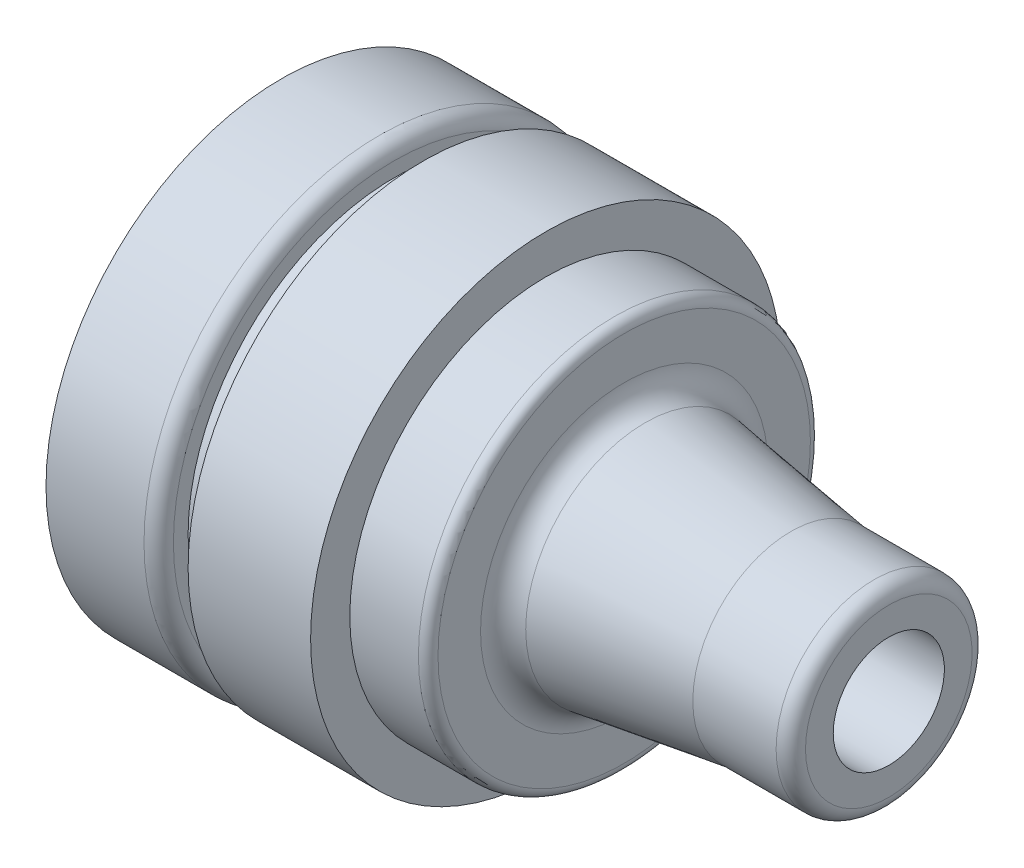
ISO-10303-21;
HEADER;
FILE_DESCRIPTION(('STEP AP214'),'2;1');
FILE_NAME('part.step','',(''),(''),'','','');
FILE_SCHEMA(('AUTOMOTIVE_DESIGN { 1 0 10303 214 1 1 1 1 }'));
ENDSEC;
DATA;
#1=APPLICATION_CONTEXT('core data for automotive mechanical design processes');
#2=APPLICATION_PROTOCOL_DEFINITION('international standard','automotive_design',2000,#1);
#3=PRODUCT_CONTEXT('',#1,'mechanical');
#4=PRODUCT('Part','Part','',(#3));
#5=PRODUCT_RELATED_PRODUCT_CATEGORY('part','',(#4));
#6=PRODUCT_DEFINITION_FORMATION('','',#4);
#7=PRODUCT_DEFINITION_CONTEXT('part definition',#1,'design');
#8=PRODUCT_DEFINITION('design','',#6,#7);
#9=PRODUCT_DEFINITION_SHAPE('','',#8);
#10=(LENGTH_UNIT() NAMED_UNIT(*) SI_UNIT(.MILLI.,.METRE.));
#11=(NAMED_UNIT(*) PLANE_ANGLE_UNIT() SI_UNIT($,.RADIAN.));
#12=(NAMED_UNIT(*) SI_UNIT($,.STERADIAN.) SOLID_ANGLE_UNIT());
#13=UNCERTAINTY_MEASURE_WITH_UNIT(LENGTH_MEASURE(1.E-05),#10,'distance_accuracy_value','');
#14=(GEOMETRIC_REPRESENTATION_CONTEXT(3) GLOBAL_UNCERTAINTY_ASSIGNED_CONTEXT((#13)) GLOBAL_UNIT_ASSIGNED_CONTEXT((#10,
#11,#12)) REPRESENTATION_CONTEXT('',''));
#15=CARTESIAN_POINT('',(0.,0.,0.));
#16=DIRECTION('',(0.,0.,1.));
#17=DIRECTION('',(1.,0.,0.));
#18=AXIS2_PLACEMENT_3D('',#15,#16,#17);
#19=CARTESIAN_POINT('',(14.040782396088,0.,0.));
#20=DIRECTION('',(-1.,0.,0.));
#21=DIRECTION('',(0.,0.,1.));
#22=AXIS2_PLACEMENT_3D('',#19,#20,#21);
#23=PLANE('',#22);
#24=CARTESIAN_POINT('',(14.040782396088,0.,0.));
#25=DIRECTION('',(-1.,0.,0.));
#26=DIRECTION('',(0.,0.,1.));
#27=AXIS2_PLACEMENT_3D('',#24,#25,#26);
#28=CIRCLE('',#27,45.);
#29=CARTESIAN_POINT('',(14.040782396088,0.,45.));
#30=VERTEX_POINT('',#29);
#31=EDGE_CURVE('E10',#30,#30,#28,.T.);
#32=ORIENTED_EDGE('',*,*,#31,.F.);
#33=EDGE_LOOP('',(#32));
#34=FACE_BOUND('',#33,.T.);
#35=CARTESIAN_POINT('',(14.040782396088,0.,0.));
#36=DIRECTION('',(-1.,0.,0.));
#37=DIRECTION('',(0.,0.,1.));
#38=AXIS2_PLACEMENT_3D('',#35,#36,#37);
#39=CIRCLE('',#38,42.);
#40=CARTESIAN_POINT('',(14.040782396088,0.,42.));
#41=VERTEX_POINT('',#40);
#42=EDGE_CURVE('E97',#41,#41,#39,.T.);
#43=ORIENTED_EDGE('',*,*,#42,.T.);
#44=EDGE_LOOP('',(#43));
#45=FACE_BOUND('',#44,.T.);
#46=ADVANCED_FACE('F33',(#34,#45),#23,.F.);
#47=CARTESIAN_POINT('',(11.040782396088,0.,0.));
#48=DIRECTION('',(-1.,0.,0.));
#49=DIRECTION('',(0.,0.,1.));
#50=AXIS2_PLACEMENT_3D('',#47,#48,#49);
#51=TOROIDAL_SURFACE('',#50,45.,3.);
#52=CARTESIAN_POINT('',(11.040782396088,0.,0.));
#53=DIRECTION('',(-1.,0.,0.));
#54=DIRECTION('',(0.,0.,1.));
#55=AXIS2_PLACEMENT_3D('',#52,#53,#54);
#56=CIRCLE('',#55,48.);
#57=CARTESIAN_POINT('',(11.040782396088,0.,48.));
#58=VERTEX_POINT('',#57);
#59=EDGE_CURVE('E39',#58,#58,#56,.T.);
#60=ORIENTED_EDGE('',*,*,#59,.F.);
#61=EDGE_LOOP('',(#60));
#62=FACE_BOUND('',#61,.T.);
#63=ORIENTED_EDGE('',*,*,#31,.T.);
#64=EDGE_LOOP('',(#63));
#65=FACE_BOUND('',#64,.T.);
#66=ADVANCED_FACE('F132',(#62,#65),#51,.T.);
#67=CARTESIAN_POINT('',(0.,0.,0.));
#68=DIRECTION('',(-1.,0.,0.));
#69=DIRECTION('',(0.,0.,1.));
#70=AXIS2_PLACEMENT_3D('',#67,#68,#69);
#71=CYLINDRICAL_SURFACE('',#70,48.);
#72=CARTESIAN_POINT('',(-8.95921760391199,0.,0.));
#73=DIRECTION('',(-1.,0.,0.));
#74=DIRECTION('',(0.,0.,1.));
#75=AXIS2_PLACEMENT_3D('',#72,#73,#74);
#76=CIRCLE('',#75,48.);
#77=CARTESIAN_POINT('',(-8.95921760391199,0.,48.));
#78=VERTEX_POINT('',#77);
#79=EDGE_CURVE('E43',#78,#78,#76,.T.);
#80=ORIENTED_EDGE('',*,*,#79,.F.);
#81=EDGE_LOOP('',(#80));
#82=FACE_BOUND('',#81,.T.);
#83=ORIENTED_EDGE('',*,*,#59,.T.);
#84=EDGE_LOOP('',(#83));
#85=FACE_BOUND('',#84,.T.);
#86=ADVANCED_FACE('F137',(#82,#85),#71,.T.);
#87=CARTESIAN_POINT('',(-8.95921760391199,0.,0.));
#88=DIRECTION('',(1.,0.,0.));
#89=DIRECTION('',(0.,0.,-1.));
#90=AXIS2_PLACEMENT_3D('',#87,#88,#89);
#91=PLANE('',#90);
#92=CARTESIAN_POINT('',(-8.95921760391199,0.,0.));
#93=DIRECTION('',(-1.,0.,0.));
#94=DIRECTION('',(0.,0.,1.));
#95=AXIS2_PLACEMENT_3D('',#92,#93,#94);
#96=CIRCLE('',#95,38.);
#97=CARTESIAN_POINT('',(-8.95921760391199,0.,38.));
#98=VERTEX_POINT('',#97);
#99=EDGE_CURVE('E47',#98,#98,#96,.T.);
#100=ORIENTED_EDGE('',*,*,#99,.F.);
#101=EDGE_LOOP('',(#100));
#102=FACE_BOUND('',#101,.T.);
#103=ORIENTED_EDGE('',*,*,#79,.T.);
#104=EDGE_LOOP('',(#103));
#105=FACE_BOUND('',#104,.T.);
#106=ADVANCED_FACE('F142',(#102,#105),#91,.F.);
#107=CARTESIAN_POINT('',(-8.95921760391199,0.,0.));
#108=DIRECTION('',(-1.,0.,0.));
#109=DIRECTION('',(0.,0.,1.));
#110=AXIS2_PLACEMENT_3D('',#107,#108,#109);
#111=CONICAL_SURFACE('',#110,38.,1.12844452455231);
#112=CARTESIAN_POINT('',(0.,0.,0.));
#113=DIRECTION('',(-1.,0.,0.));
#114=DIRECTION('',(0.,0.,1.));
#115=AXIS2_PLACEMENT_3D('',#112,#113,#114);
#116=CIRCLE('',#115,19.085);
#117=CARTESIAN_POINT('',(0.,0.,19.085));
#118=VERTEX_POINT('',#117);
#119=EDGE_CURVE('E52',#118,#118,#116,.T.);
#120=ORIENTED_EDGE('',*,*,#119,.F.);
#121=EDGE_LOOP('',(#120));
#122=FACE_BOUND('',#121,.T.);
#123=ORIENTED_EDGE('',*,*,#99,.T.);
#124=EDGE_LOOP('',(#123));
#125=FACE_BOUND('',#124,.T.);
#126=ADVANCED_FACE('F148',(#122,#125),#111,.F.);
#127=CARTESIAN_POINT('',(0.,0.,0.));
#128=DIRECTION('',(-1.,0.,0.));
#129=DIRECTION('',(0.,0.,1.));
#130=AXIS2_PLACEMENT_3D('',#127,#128,#129);
#131=CYLINDRICAL_SURFACE('',#130,19.085);
#132=CARTESIAN_POINT('',(57.520391198044,0.,0.));
#133=DIRECTION('',(-1.,0.,0.));
#134=DIRECTION('',(0.,0.,1.));
#135=AXIS2_PLACEMENT_3D('',#132,#133,#134);
#136=CIRCLE('',#135,19.085);
#137=CARTESIAN_POINT('',(57.520391198044,0.,19.085));
#138=VERTEX_POINT('',#137);
#139=EDGE_CURVE('E55',#138,#138,#136,.T.);
#140=ORIENTED_EDGE('',*,*,#139,.F.);
#141=EDGE_LOOP('',(#140));
#142=FACE_BOUND('',#141,.T.);
#143=ORIENTED_EDGE('',*,*,#119,.T.);
#144=EDGE_LOOP('',(#143));
#145=FACE_BOUND('',#144,.T.);
#146=ADVANCED_FACE('F152',(#142,#145),#131,.F.);
#147=CARTESIAN_POINT('',(57.520391198044,0.,0.));
#148=DIRECTION('',(1.,0.,0.));
#149=DIRECTION('',(0.,0.,-1.));
#150=AXIS2_PLACEMENT_3D('',#147,#148,#149);
#151=PLANE('',#150);
#152=CARTESIAN_POINT('',(57.520391198044,0.,0.));
#153=DIRECTION('',(-1.,0.,0.));
#154=DIRECTION('',(0.,0.,1.));
#155=AXIS2_PLACEMENT_3D('',#152,#153,#154);
#156=CIRCLE('',#155,11.3390097799511);
#157=CARTESIAN_POINT('',(57.520391198044,0.,11.3390097799511));
#158=VERTEX_POINT('',#157);
#159=EDGE_CURVE('E58',#158,#158,#156,.T.);
#160=ORIENTED_EDGE('',*,*,#159,.F.);
#161=EDGE_LOOP('',(#160));
#162=FACE_BOUND('',#161,.T.);
#163=ORIENTED_EDGE('',*,*,#139,.T.);
#164=EDGE_LOOP('',(#163));
#165=FACE_BOUND('',#164,.T.);
#166=ADVANCED_FACE('F156',(#162,#165),#151,.F.);
#167=CARTESIAN_POINT('',(0.,0.,0.));
#168=DIRECTION('',(-1.,0.,0.));
#169=DIRECTION('',(0.,0.,1.));
#170=AXIS2_PLACEMENT_3D('',#167,#168,#169);
#171=CYLINDRICAL_SURFACE('',#170,11.3390097799511);
#172=CARTESIAN_POINT('',(115.040782396088,0.,0.));
#173=DIRECTION('',(-1.,0.,0.));
#174=DIRECTION('',(0.,0.,1.));
#175=AXIS2_PLACEMENT_3D('',#172,#173,#174);
#176=CIRCLE('',#175,11.3390097799511);
#177=CARTESIAN_POINT('',(115.040782396088,0.,11.3390097799511));
#178=VERTEX_POINT('',#177);
#179=EDGE_CURVE('E61',#178,#178,#176,.T.);
#180=ORIENTED_EDGE('',*,*,#179,.F.);
#181=EDGE_LOOP('',(#180));
#182=FACE_BOUND('',#181,.T.);
#183=ORIENTED_EDGE('',*,*,#159,.T.);
#184=EDGE_LOOP('',(#183));
#185=FACE_BOUND('',#184,.T.);
#186=ADVANCED_FACE('F160',(#182,#185),#171,.F.);
#187=CARTESIAN_POINT('',(115.040782396088,0.,0.));
#188=DIRECTION('',(-1.,0.,0.));
#189=DIRECTION('',(0.,0.,1.));
#190=AXIS2_PLACEMENT_3D('',#187,#188,#189);
#191=PLANE('',#190);
#192=CARTESIAN_POINT('',(115.040782396088,0.,0.));
#193=DIRECTION('',(-1.,0.,0.));
#194=DIRECTION('',(0.,0.,1.));
#195=AXIS2_PLACEMENT_3D('',#192,#193,#194);
#196=CIRCLE('',#195,17.);
#197=CARTESIAN_POINT('',(115.040782396088,0.,17.));
#198=VERTEX_POINT('',#197);
#199=EDGE_CURVE('E64',#198,#198,#196,.T.);
#200=ORIENTED_EDGE('',*,*,#199,.F.);
#201=EDGE_LOOP('',(#200));
#202=FACE_BOUND('',#201,.T.);
#203=ORIENTED_EDGE('',*,*,#179,.T.);
#204=EDGE_LOOP('',(#203));
#205=FACE_BOUND('',#204,.T.);
#206=ADVANCED_FACE('F164',(#202,#205),#191,.F.);
#207=CARTESIAN_POINT('',(112.040782396088,0.,0.));
#208=DIRECTION('',(-1.,0.,0.));
#209=DIRECTION('',(0.,0.,1.));
#210=AXIS2_PLACEMENT_3D('',#207,#208,#209);
#211=TOROIDAL_SURFACE('',#210,17.,3.);
#212=ORIENTED_EDGE('',*,*,#199,.T.);
#213=EDGE_LOOP('',(#212));
#214=FACE_BOUND('',#213,.T.);
#215=CARTESIAN_POINT('',(112.040782396088,0.,0.));
#216=DIRECTION('',(-1.,0.,0.));
#217=DIRECTION('',(0.,0.,1.));
#218=AXIS2_PLACEMENT_3D('',#215,#216,#217);
#219=CIRCLE('',#218,20.);
#220=CARTESIAN_POINT('',(112.040782396088,0.,20.));
#221=VERTEX_POINT('',#220);
#222=EDGE_CURVE('E67',#221,#221,#219,.T.);
#223=ORIENTED_EDGE('',*,*,#222,.F.);
#224=EDGE_LOOP('',(#223));
#225=FACE_BOUND('',#224,.T.);
#226=ADVANCED_FACE('F168',(#214,#225),#211,.T.);
#227=CARTESIAN_POINT('',(0.,0.,0.));
#228=DIRECTION('',(-1.,0.,0.));
#229=DIRECTION('',(0.,0.,1.));
#230=AXIS2_PLACEMENT_3D('',#227,#228,#229);
#231=CYLINDRICAL_SURFACE('',#230,20.);
#232=ORIENTED_EDGE('',*,*,#222,.T.);
#233=EDGE_LOOP('',(#232));
#234=FACE_BOUND('',#233,.T.);
#235=CARTESIAN_POINT('',(95.040782396088,0.,0.));
#236=DIRECTION('',(-1.,0.,0.));
#237=DIRECTION('',(0.,0.,1.));
#238=AXIS2_PLACEMENT_3D('',#235,#236,#237);
#239=CIRCLE('',#238,20.);
#240=CARTESIAN_POINT('',(95.040782396088,0.,20.));
#241=VERTEX_POINT('',#240);
#242=EDGE_CURVE('E70',#241,#241,#239,.T.);
#243=ORIENTED_EDGE('',*,*,#242,.F.);
#244=EDGE_LOOP('',(#243));
#245=FACE_BOUND('',#244,.T.);
#246=ADVANCED_FACE('F172',(#234,#245),#231,.T.);
#247=CARTESIAN_POINT('',(95.040782396088,0.,0.));
#248=DIRECTION('',(-1.,0.,0.));
#249=DIRECTION('',(0.,0.,1.));
#250=AXIS2_PLACEMENT_3D('',#247,#248,#249);
#251=CONICAL_SURFACE('',#250,20.,0.146012257711275);
#252=CARTESIAN_POINT('',(65.3133124436138,0.,0.));
#253=DIRECTION('',(-1.,0.,0.));
#254=DIRECTION('',(0.,0.,1.));
#255=AXIS2_PLACEMENT_3D('',#252,#253,#254);
#256=CIRCLE('',#255,24.3716867577168);
#257=CARTESIAN_POINT('',(65.3133124436138,0.,24.3716867577168));
#258=VERTEX_POINT('',#257);
#259=EDGE_CURVE('E73',#258,#258,#256,.T.);
#260=ORIENTED_EDGE('',*,*,#259,.F.);
#261=EDGE_LOOP('',(#260));
#262=FACE_BOUND('',#261,.T.);
#263=ORIENTED_EDGE('',*,*,#242,.T.);
#264=EDGE_LOOP('',(#263));
#265=FACE_BOUND('',#264,.T.);
#266=ADVANCED_FACE('F176',(#262,#265),#251,.T.);
#267=CARTESIAN_POINT('',(66.040782396088,0.,0.));
#268=DIRECTION('',(-1.,0.,0.));
#269=DIRECTION('',(0.,0.,1.));
#270=AXIS2_PLACEMENT_3D('',#267,#268,#269);
#271=TOROIDAL_SURFACE('',#270,29.3184824345411,5.);
#272=CARTESIAN_POINT('',(61.040782396088,0.,0.));
#273=DIRECTION('',(-1.,0.,0.));
#274=DIRECTION('',(0.,0.,1.));
#275=AXIS2_PLACEMENT_3D('',#272,#273,#274);
#276=CIRCLE('',#275,29.3184824345411);
#277=CARTESIAN_POINT('',(61.040782396088,0.,29.3184824345411));
#278=VERTEX_POINT('',#277);
#279=EDGE_CURVE('E76',#278,#278,#276,.T.);
#280=ORIENTED_EDGE('',*,*,#279,.F.);
#281=EDGE_LOOP('',(#280));
#282=FACE_BOUND('',#281,.T.);
#283=ORIENTED_EDGE('',*,*,#259,.T.);
#284=EDGE_LOOP('',(#283));
#285=FACE_BOUND('',#284,.T.);
#286=ADVANCED_FACE('F180',(#282,#285),#271,.F.);
#287=CARTESIAN_POINT('',(61.040782396088,0.,0.));
#288=DIRECTION('',(-1.,0.,0.));
#289=DIRECTION('',(0.,0.,1.));
#290=AXIS2_PLACEMENT_3D('',#287,#288,#289);
#291=PLANE('',#290);
#292=CARTESIAN_POINT('',(61.040782396088,0.,0.));
#293=DIRECTION('',(-1.,0.,0.));
#294=DIRECTION('',(0.,0.,1.));
#295=AXIS2_PLACEMENT_3D('',#292,#293,#294);
#296=CIRCLE('',#295,38.);
#297=CARTESIAN_POINT('',(61.040782396088,0.,38.));
#298=VERTEX_POINT('',#297);
#299=EDGE_CURVE('E79',#298,#298,#296,.T.);
#300=ORIENTED_EDGE('',*,*,#299,.F.);
#301=EDGE_LOOP('',(#300));
#302=FACE_BOUND('',#301,.T.);
#303=ORIENTED_EDGE('',*,*,#279,.T.);
#304=EDGE_LOOP('',(#303));
#305=FACE_BOUND('',#304,.T.);
#306=ADVANCED_FACE('F184',(#302,#305),#291,.F.);
#307=CARTESIAN_POINT('',(59.040782396088,0.,0.));
#308=DIRECTION('',(-1.,0.,0.));
#309=DIRECTION('',(0.,0.,1.));
#310=AXIS2_PLACEMENT_3D('',#307,#308,#309);
#311=TOROIDAL_SURFACE('',#310,38.,2.);
#312=CARTESIAN_POINT('',(59.040782396088,0.,0.));
#313=DIRECTION('',(-1.,0.,0.));
#314=DIRECTION('',(0.,0.,1.));
#315=AXIS2_PLACEMENT_3D('',#312,#313,#314);
#316=CIRCLE('',#315,40.);
#317=CARTESIAN_POINT('',(59.040782396088,0.,40.));
#318=VERTEX_POINT('',#317);
#319=EDGE_CURVE('E82',#318,#318,#316,.T.);
#320=ORIENTED_EDGE('',*,*,#319,.F.);
#321=EDGE_LOOP('',(#320));
#322=FACE_BOUND('',#321,.T.);
#323=ORIENTED_EDGE('',*,*,#299,.T.);
#324=EDGE_LOOP('',(#323));
#325=FACE_BOUND('',#324,.T.);
#326=ADVANCED_FACE('F128',(#322,#325),#311,.T.);
#327=CARTESIAN_POINT('',(0.,0.,0.));
#328=DIRECTION('',(-1.,0.,0.));
#329=DIRECTION('',(0.,0.,1.));
#330=AXIS2_PLACEMENT_3D('',#327,#328,#329);
#331=CYLINDRICAL_SURFACE('',#330,40.);
#332=CARTESIAN_POINT('',(45.040782396088,0.,0.));
#333=DIRECTION('',(-1.,0.,0.));
#334=DIRECTION('',(0.,0.,1.));
#335=AXIS2_PLACEMENT_3D('',#332,#333,#334);
#336=CIRCLE('',#335,40.);
#337=CARTESIAN_POINT('',(45.040782396088,0.,40.));
#338=VERTEX_POINT('',#337);
#339=EDGE_CURVE('E85',#338,#338,#336,.T.);
#340=ORIENTED_EDGE('',*,*,#339,.F.);
#341=EDGE_LOOP('',(#340));
#342=FACE_BOUND('',#341,.T.);
#343=ORIENTED_EDGE('',*,*,#319,.T.);
#344=EDGE_LOOP('',(#343));
#345=FACE_BOUND('',#344,.T.);
#346=ADVANCED_FACE('F122',(#342,#345),#331,.T.);
#347=CARTESIAN_POINT('',(45.040782396088,0.,0.));
#348=DIRECTION('',(1.,0.,0.));
#349=DIRECTION('',(0.,0.,-1.));
#350=AXIS2_PLACEMENT_3D('',#347,#348,#349);
#351=PLANE('',#350);
#352=ORIENTED_EDGE('',*,*,#339,.T.);
#353=EDGE_LOOP('',(#352));
#354=FACE_BOUND('',#353,.T.);
#355=CARTESIAN_POINT('',(45.040782396088,0.,0.));
#356=DIRECTION('',(-1.,0.,0.));
#357=DIRECTION('',(0.,0.,1.));
#358=AXIS2_PLACEMENT_3D('',#355,#356,#357);
#359=CIRCLE('',#358,48.);
#360=CARTESIAN_POINT('',(45.040782396088,0.,48.));
#361=VERTEX_POINT('',#360);
#362=EDGE_CURVE('E88',#361,#361,#359,.T.);
#363=ORIENTED_EDGE('',*,*,#362,.F.);
#364=EDGE_LOOP('',(#363));
#365=FACE_BOUND('',#364,.T.);
#366=ADVANCED_FACE('F117',(#354,#365),#351,.T.);
#367=CARTESIAN_POINT('',(0.,0.,0.));
#368=DIRECTION('',(-1.,0.,0.));
#369=DIRECTION('',(0.,0.,1.));
#370=AXIS2_PLACEMENT_3D('',#367,#368,#369);
#371=CYLINDRICAL_SURFACE('',#370,48.);
#372=CARTESIAN_POINT('',(20.040782396088,0.,0.));
#373=DIRECTION('',(-1.,0.,0.));
#374=DIRECTION('',(0.,0.,1.));
#375=AXIS2_PLACEMENT_3D('',#372,#373,#374);
#376=CIRCLE('',#375,48.);
#377=CARTESIAN_POINT('',(20.040782396088,0.,48.));
#378=VERTEX_POINT('',#377);
#379=EDGE_CURVE('E91',#378,#378,#376,.T.);
#380=ORIENTED_EDGE('',*,*,#379,.F.);
#381=EDGE_LOOP('',(#380));
#382=FACE_BOUND('',#381,.T.);
#383=ORIENTED_EDGE('',*,*,#362,.T.);
#384=EDGE_LOOP('',(#383));
#385=FACE_BOUND('',#384,.T.);
#386=ADVANCED_FACE('F111',(#382,#385),#371,.T.);
#387=CARTESIAN_POINT('',(20.040782396088,0.,0.));
#388=DIRECTION('',(1.,0.,0.));
#389=DIRECTION('',(0.,0.,-1.));
#390=AXIS2_PLACEMENT_3D('',#387,#388,#389);
#391=PLANE('',#390);
#392=CARTESIAN_POINT('',(20.040782396088,0.,0.));
#393=DIRECTION('',(-1.,0.,0.));
#394=DIRECTION('',(0.,0.,1.));
#395=AXIS2_PLACEMENT_3D('',#392,#393,#394);
#396=CIRCLE('',#395,42.);
#397=CARTESIAN_POINT('',(20.040782396088,0.,42.));
#398=VERTEX_POINT('',#397);
#399=EDGE_CURVE('E94',#398,#398,#396,.T.);
#400=ORIENTED_EDGE('',*,*,#399,.F.);
#401=EDGE_LOOP('',(#400));
#402=FACE_BOUND('',#401,.T.);
#403=ORIENTED_EDGE('',*,*,#379,.T.);
#404=EDGE_LOOP('',(#403));
#405=FACE_BOUND('',#404,.T.);
#406=ADVANCED_FACE('F105',(#402,#405),#391,.F.);
#407=CARTESIAN_POINT('',(0.,0.,0.));
#408=DIRECTION('',(-1.,0.,0.));
#409=DIRECTION('',(0.,0.,1.));
#410=AXIS2_PLACEMENT_3D('',#407,#408,#409);
#411=CYLINDRICAL_SURFACE('',#410,42.);
#412=ORIENTED_EDGE('',*,*,#42,.F.);
#413=EDGE_LOOP('',(#412));
#414=FACE_BOUND('',#413,.T.);
#415=ORIENTED_EDGE('',*,*,#399,.T.);
#416=EDGE_LOOP('',(#415));
#417=FACE_BOUND('',#416,.T.);
#418=ADVANCED_FACE('F102',(#414,#417),#411,.T.);
#419=CLOSED_SHELL('',(#46,#66,#86,#106,#126,#146,#166,#186,#206,#226,#246,#266,#286,#306,#326,
#346,#366,#386,#406,#418));
#420=MANIFOLD_SOLID_BREP('B2',#419);
#421=ADVANCED_BREP_SHAPE_REPRESENTATION('',(#18,#420),#14);
#422=SHAPE_DEFINITION_REPRESENTATION(#9,#421);
ENDSEC;
END-ISO-10303-21;
